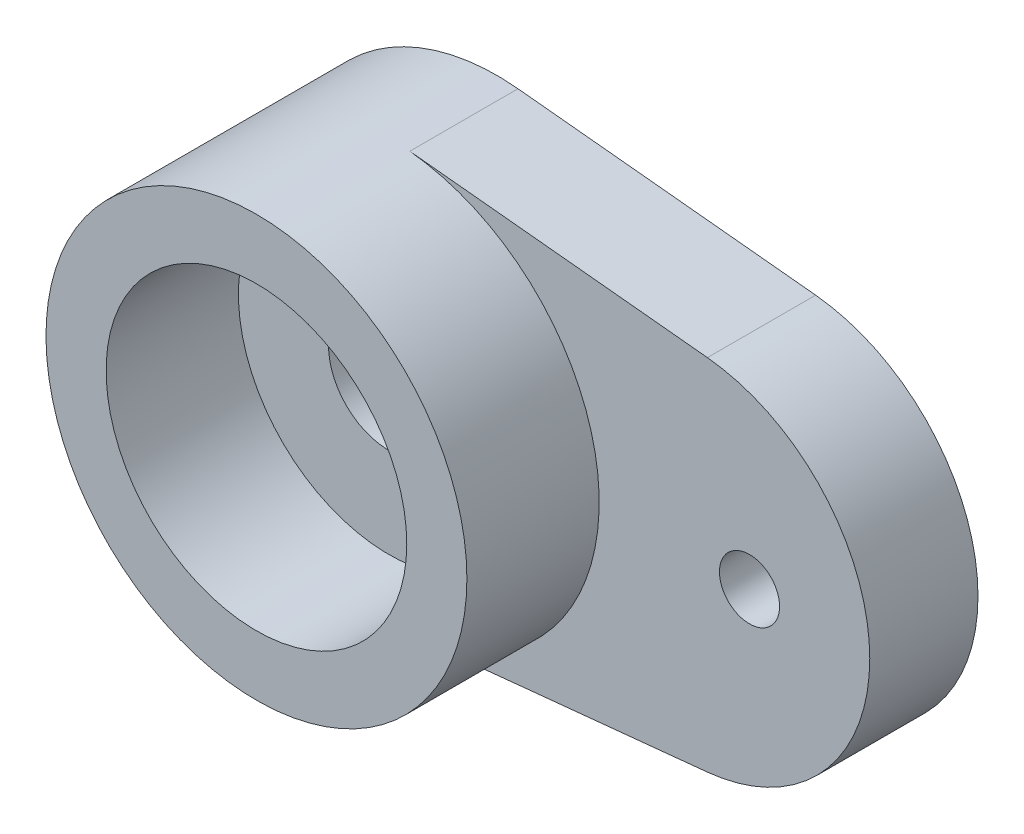
ISO-10303-21;
HEADER;
FILE_DESCRIPTION(('STEP AP214'),'2;1');
FILE_NAME('part.step','',(''),(''),'','','');
FILE_SCHEMA(('AUTOMOTIVE_DESIGN { 1 0 10303 214 1 1 1 1 }'));
ENDSEC;
DATA;
#1=APPLICATION_CONTEXT('core data for automotive mechanical design processes');
#2=APPLICATION_PROTOCOL_DEFINITION('international standard','automotive_design',2000,#1);
#3=PRODUCT_CONTEXT('',#1,'mechanical');
#4=PRODUCT('Part','Part','',(#3));
#5=PRODUCT_RELATED_PRODUCT_CATEGORY('part','',(#4));
#6=PRODUCT_DEFINITION_FORMATION('','',#4);
#7=PRODUCT_DEFINITION_CONTEXT('part definition',#1,'design');
#8=PRODUCT_DEFINITION('design','',#6,#7);
#9=PRODUCT_DEFINITION_SHAPE('','',#8);
#10=(LENGTH_UNIT() NAMED_UNIT(*) SI_UNIT(.MILLI.,.METRE.));
#11=(NAMED_UNIT(*) PLANE_ANGLE_UNIT() SI_UNIT($,.RADIAN.));
#12=(NAMED_UNIT(*) SI_UNIT($,.STERADIAN.) SOLID_ANGLE_UNIT());
#13=UNCERTAINTY_MEASURE_WITH_UNIT(LENGTH_MEASURE(1.E-05),#10,'distance_accuracy_value','');
#14=(GEOMETRIC_REPRESENTATION_CONTEXT(3) GLOBAL_UNCERTAINTY_ASSIGNED_CONTEXT((#13)) GLOBAL_UNIT_ASSIGNED_CONTEXT((#10,
#11,#12)) REPRESENTATION_CONTEXT('',''));
#15=CARTESIAN_POINT('',(0.,0.,0.));
#16=DIRECTION('',(0.,0.,1.));
#17=DIRECTION('',(1.,0.,0.));
#18=AXIS2_PLACEMENT_3D('',#15,#16,#17);
#19=CARTESIAN_POINT('',(0.,0.,1.8));
#20=DIRECTION('',(0.,0.,1.));
#21=DIRECTION('',(1.,0.,0.));
#22=AXIS2_PLACEMENT_3D('',#19,#20,#21);
#23=PLANE('',#22);
#24=CARTESIAN_POINT('',(0.,0.,1.8));
#25=DIRECTION('',(0.,0.,1.));
#26=DIRECTION('',(1.,0.,0.));
#27=AXIS2_PLACEMENT_3D('',#24,#25,#26);
#28=CIRCLE('',#27,1.);
#29=CARTESIAN_POINT('',(1.,0.,1.8));
#30=VERTEX_POINT('',#29);
#31=EDGE_CURVE('E116',#30,#30,#28,.T.);
#32=ORIENTED_EDGE('',*,*,#31,.F.);
#33=EDGE_LOOP('',(#32));
#34=FACE_BOUND('',#33,.T.);
#35=CARTESIAN_POINT('',(0.,0.,1.8));
#36=DIRECTION('',(0.,0.,1.));
#37=DIRECTION('',(1.,0.,0.));
#38=AXIS2_PLACEMENT_3D('',#35,#36,#37);
#39=CIRCLE('',#38,2.5);
#40=CARTESIAN_POINT('',(2.5,0.,1.8));
#41=VERTEX_POINT('',#40);
#42=EDGE_CURVE('E133',#41,#41,#39,.T.);
#43=ORIENTED_EDGE('',*,*,#42,.T.);
#44=EDGE_LOOP('',(#43));
#45=FACE_BOUND('',#44,.T.);
#46=ADVANCED_FACE('F33',(#34,#45),#23,.T.);
#47=CARTESIAN_POINT('',(0.,0.,1.8));
#48=DIRECTION('',(0.,0.,1.));
#49=DIRECTION('',(1.,0.,0.));
#50=AXIS2_PLACEMENT_3D('',#47,#48,#49);
#51=CIRCLE('',#50,3.5);
#52=CARTESIAN_POINT('',(0.35,-3.48245602987317,1.8));
#53=VERTEX_POINT('',#52);
#54=CARTESIAN_POINT('',(0.35,3.48245602987317,1.8));
#55=VERTEX_POINT('',#54);
#56=EDGE_CURVE('E11',#53,#55,#51,.T.);
#57=ORIENTED_EDGE('',*,*,#56,.F.);
#58=DIRECTION('',(0.99498743710662,0.1,0.));
#59=VECTOR('',#58,1.);
#60=CARTESIAN_POINT('',(5.3,-2.98496231131986,1.8));
#61=LINE('',#60,#59);
#62=CARTESIAN_POINT('',(5.3,-2.98496231131986,1.8));
#63=VERTEX_POINT('',#62);
#64=EDGE_CURVE('E102',#53,#63,#61,.T.);
#65=ORIENTED_EDGE('',*,*,#64,.T.);
#66=CARTESIAN_POINT('',(5.,0.,1.8));
#67=DIRECTION('',(0.,0.,1.));
#68=DIRECTION('',(-1.,0.,0.));
#69=AXIS2_PLACEMENT_3D('',#66,#67,#68);
#70=CIRCLE('',#69,3.);
#71=CARTESIAN_POINT('',(5.3,2.98496231131986,1.8));
#72=VERTEX_POINT('',#71);
#73=EDGE_CURVE('E52',#63,#72,#70,.T.);
#74=ORIENTED_EDGE('',*,*,#73,.T.);
#75=DIRECTION('',(-0.99498743710662,0.1,0.));
#76=VECTOR('',#75,1.);
#77=CARTESIAN_POINT('',(0.35,3.48245602987317,1.8));
#78=LINE('',#77,#76);
#79=EDGE_CURVE('E83',#72,#55,#78,.T.);
#80=ORIENTED_EDGE('',*,*,#79,.T.);
#81=EDGE_LOOP('',(#57,#65,#74,#80));
#82=FACE_BOUND('',#81,.T.);
#83=CARTESIAN_POINT('',(6.,0.,1.8));
#84=DIRECTION('',(0.,0.,1.));
#85=DIRECTION('',(1.,0.,0.));
#86=AXIS2_PLACEMENT_3D('',#83,#84,#85);
#87=CIRCLE('',#86,0.5);
#88=CARTESIAN_POINT('',(6.5,0.,1.8));
#89=VERTEX_POINT('',#88);
#90=EDGE_CURVE('E121',#89,#89,#87,.T.);
#91=ORIENTED_EDGE('',*,*,#90,.F.);
#92=EDGE_LOOP('',(#91));
#93=FACE_BOUND('',#92,.T.);
#94=ADVANCED_FACE('F89',(#82,#93),#23,.T.);
#95=CARTESIAN_POINT('',(0.,0.,0.));
#96=DIRECTION('',(0.,0.,1.));
#97=DIRECTION('',(1.,0.,0.));
#98=AXIS2_PLACEMENT_3D('',#95,#96,#97);
#99=PLANE('',#98);
#100=CARTESIAN_POINT('',(0.,0.,0.));
#101=DIRECTION('',(0.,0.,1.));
#102=DIRECTION('',(1.,0.,0.));
#103=AXIS2_PLACEMENT_3D('',#100,#101,#102);
#104=CIRCLE('',#103,1.);
#105=CARTESIAN_POINT('',(1.,0.,0.));
#106=VERTEX_POINT('',#105);
#107=EDGE_CURVE('E118',#106,#106,#104,.T.);
#108=ORIENTED_EDGE('',*,*,#107,.T.);
#109=EDGE_LOOP('',(#108));
#110=FACE_BOUND('',#109,.T.);
#111=CARTESIAN_POINT('',(0.,0.,0.));
#112=DIRECTION('',(0.,0.,1.));
#113=DIRECTION('',(1.,0.,0.));
#114=AXIS2_PLACEMENT_3D('',#111,#112,#113);
#115=CIRCLE('',#114,3.5);
#116=CARTESIAN_POINT('',(0.35,3.48245602987317,0.));
#117=VERTEX_POINT('',#116);
#118=CARTESIAN_POINT('',(0.35,-3.48245602987317,0.));
#119=VERTEX_POINT('',#118);
#120=EDGE_CURVE('E95',#117,#119,#115,.T.);
#121=ORIENTED_EDGE('',*,*,#120,.F.);
#122=DIRECTION('',(-0.99498743710662,0.1,0.));
#123=VECTOR('',#122,1.);
#124=CARTESIAN_POINT('',(0.35,3.48245602987317,0.));
#125=LINE('',#124,#123);
#126=CARTESIAN_POINT('',(5.3,2.98496231131986,0.));
#127=VERTEX_POINT('',#126);
#128=EDGE_CURVE('E75',#127,#117,#125,.T.);
#129=ORIENTED_EDGE('',*,*,#128,.F.);
#130=CARTESIAN_POINT('',(5.,0.,0.));
#131=DIRECTION('',(0.,0.,1.));
#132=DIRECTION('',(-1.,0.,0.));
#133=AXIS2_PLACEMENT_3D('',#130,#131,#132);
#134=CIRCLE('',#133,3.);
#135=CARTESIAN_POINT('',(5.3,-2.98496231131986,0.));
#136=VERTEX_POINT('',#135);
#137=EDGE_CURVE('E69',#136,#127,#134,.T.);
#138=ORIENTED_EDGE('',*,*,#137,.F.);
#139=DIRECTION('',(0.99498743710662,0.1,0.));
#140=VECTOR('',#139,1.);
#141=CARTESIAN_POINT('',(5.3,-2.98496231131986,0.));
#142=LINE('',#141,#140);
#143=EDGE_CURVE('E113',#119,#136,#142,.T.);
#144=ORIENTED_EDGE('',*,*,#143,.F.);
#145=EDGE_LOOP('',(#121,#129,#138,#144));
#146=FACE_BOUND('',#145,.T.);
#147=CARTESIAN_POINT('',(6.,0.,0.));
#148=DIRECTION('',(0.,0.,1.));
#149=DIRECTION('',(1.,0.,0.));
#150=AXIS2_PLACEMENT_3D('',#147,#148,#149);
#151=CIRCLE('',#150,0.5);
#152=CARTESIAN_POINT('',(6.5,0.,0.));
#153=VERTEX_POINT('',#152);
#154=EDGE_CURVE('E124',#153,#153,#151,.T.);
#155=ORIENTED_EDGE('',*,*,#154,.T.);
#156=EDGE_LOOP('',(#155));
#157=FACE_BOUND('',#156,.T.);
#158=ADVANCED_FACE('F161',(#110,#146,#157),#99,.F.);
#159=CARTESIAN_POINT('',(0.,0.,1.8));
#160=DIRECTION('',(0.,0.,-1.));
#161=DIRECTION('',(-1.,0.,0.));
#162=AXIS2_PLACEMENT_3D('',#159,#160,#161);
#163=CYLINDRICAL_SURFACE('',#162,3.5);
#164=ORIENTED_EDGE('',*,*,#120,.T.);
#165=DIRECTION('',(0.,0.,-1.));
#166=VECTOR('',#165,1.);
#167=CARTESIAN_POINT('',(0.35,-3.48245602987317,1.8));
#168=LINE('',#167,#166);
#169=EDGE_CURVE('E43',#53,#119,#168,.T.);
#170=ORIENTED_EDGE('',*,*,#169,.F.);
#171=ORIENTED_EDGE('',*,*,#56,.T.);
#172=DIRECTION('',(0.,0.,-1.));
#173=VECTOR('',#172,1.);
#174=CARTESIAN_POINT('',(0.35,3.48245602987317,1.8));
#175=LINE('',#174,#173);
#176=EDGE_CURVE('E81',#55,#117,#175,.T.);
#177=ORIENTED_EDGE('',*,*,#176,.T.);
#178=EDGE_LOOP('',(#164,#170,#171,#177));
#179=FACE_BOUND('',#178,.T.);
#180=CARTESIAN_POINT('',(0.,0.,4.));
#181=DIRECTION('',(0.,0.,1.));
#182=DIRECTION('',(1.,0.,0.));
#183=AXIS2_PLACEMENT_3D('',#180,#181,#182);
#184=CIRCLE('',#183,3.5);
#185=CARTESIAN_POINT('',(3.5,0.,4.));
#186=VERTEX_POINT('',#185);
#187=EDGE_CURVE('E127',#186,#186,#184,.T.);
#188=ORIENTED_EDGE('',*,*,#187,.F.);
#189=EDGE_LOOP('',(#188));
#190=FACE_BOUND('',#189,.T.);
#191=ADVANCED_FACE('F35',(#179,#190),#163,.T.);
#192=CARTESIAN_POINT('',(5.3,-2.98496231131986,1.8));
#193=DIRECTION('',(-0.1,0.99498743710662,0.));
#194=DIRECTION('',(-0.99498743710662,-0.1,0.));
#195=AXIS2_PLACEMENT_3D('',#192,#193,#194);
#196=PLANE('',#195);
#197=ORIENTED_EDGE('',*,*,#143,.T.);
#198=DIRECTION('',(0.,0.,-1.));
#199=VECTOR('',#198,1.);
#200=CARTESIAN_POINT('',(5.3,-2.98496231131986,1.8));
#201=LINE('',#200,#199);
#202=EDGE_CURVE('E97',#63,#136,#201,.T.);
#203=ORIENTED_EDGE('',*,*,#202,.F.);
#204=ORIENTED_EDGE('',*,*,#64,.F.);
#205=ORIENTED_EDGE('',*,*,#169,.T.);
#206=EDGE_LOOP('',(#197,#203,#204,#205));
#207=FACE_BOUND('',#206,.T.);
#208=ADVANCED_FACE('F173',(#207),#196,.F.);
#209=CARTESIAN_POINT('',(5.,0.,1.8));
#210=DIRECTION('',(0.,0.,-1.));
#211=DIRECTION('',(-1.,0.,0.));
#212=AXIS2_PLACEMENT_3D('',#209,#210,#211);
#213=CYLINDRICAL_SURFACE('',#212,3.);
#214=ORIENTED_EDGE('',*,*,#137,.T.);
#215=DIRECTION('',(0.,0.,-1.));
#216=VECTOR('',#215,1.);
#217=CARTESIAN_POINT('',(5.3,2.98496231131986,1.8));
#218=LINE('',#217,#216);
#219=EDGE_CURVE('E87',#72,#127,#218,.T.);
#220=ORIENTED_EDGE('',*,*,#219,.F.);
#221=ORIENTED_EDGE('',*,*,#73,.F.);
#222=ORIENTED_EDGE('',*,*,#202,.T.);
#223=EDGE_LOOP('',(#214,#220,#221,#222));
#224=FACE_BOUND('',#223,.T.);
#225=ADVANCED_FACE('F171',(#224),#213,.T.);
#226=CARTESIAN_POINT('',(0.35,3.48245602987317,1.8));
#227=DIRECTION('',(-0.1,-0.99498743710662,0.));
#228=DIRECTION('',(0.99498743710662,-0.1,0.));
#229=AXIS2_PLACEMENT_3D('',#226,#227,#228);
#230=PLANE('',#229);
#231=ORIENTED_EDGE('',*,*,#128,.T.);
#232=ORIENTED_EDGE('',*,*,#176,.F.);
#233=ORIENTED_EDGE('',*,*,#79,.F.);
#234=ORIENTED_EDGE('',*,*,#219,.T.);
#235=EDGE_LOOP('',(#231,#232,#233,#234));
#236=FACE_BOUND('',#235,.T.);
#237=ADVANCED_FACE('F82',(#236),#230,.F.);
#238=CARTESIAN_POINT('',(0.,0.,1.8));
#239=DIRECTION('',(0.,0.,-1.));
#240=DIRECTION('',(-1.,0.,0.));
#241=AXIS2_PLACEMENT_3D('',#238,#239,#240);
#242=CYLINDRICAL_SURFACE('',#241,1.);
#243=ORIENTED_EDGE('',*,*,#31,.T.);
#244=EDGE_LOOP('',(#243));
#245=FACE_BOUND('',#244,.T.);
#246=ORIENTED_EDGE('',*,*,#107,.F.);
#247=EDGE_LOOP('',(#246));
#248=FACE_BOUND('',#247,.T.);
#249=ADVANCED_FACE('F152',(#245,#248),#242,.F.);
#250=CARTESIAN_POINT('',(6.,0.,1.8));
#251=DIRECTION('',(0.,0.,-1.));
#252=DIRECTION('',(-1.,0.,0.));
#253=AXIS2_PLACEMENT_3D('',#250,#251,#252);
#254=CYLINDRICAL_SURFACE('',#253,0.5);
#255=ORIENTED_EDGE('',*,*,#90,.T.);
#256=EDGE_LOOP('',(#255));
#257=FACE_BOUND('',#256,.T.);
#258=ORIENTED_EDGE('',*,*,#154,.F.);
#259=EDGE_LOOP('',(#258));
#260=FACE_BOUND('',#259,.T.);
#261=ADVANCED_FACE('F144',(#257,#260),#254,.F.);
#262=CARTESIAN_POINT('',(0.,0.,4.));
#263=DIRECTION('',(0.,0.,1.));
#264=DIRECTION('',(1.,0.,0.));
#265=AXIS2_PLACEMENT_3D('',#262,#263,#264);
#266=PLANE('',#265);
#267=ORIENTED_EDGE('',*,*,#187,.T.);
#268=EDGE_LOOP('',(#267));
#269=FACE_BOUND('',#268,.T.);
#270=CARTESIAN_POINT('',(0.,0.,4.));
#271=DIRECTION('',(0.,0.,1.));
#272=DIRECTION('',(1.,0.,0.));
#273=AXIS2_PLACEMENT_3D('',#270,#271,#272);
#274=CIRCLE('',#273,2.5);
#275=CARTESIAN_POINT('',(2.5,0.,4.));
#276=VERTEX_POINT('',#275);
#277=EDGE_CURVE('E132',#276,#276,#274,.T.);
#278=ORIENTED_EDGE('',*,*,#277,.F.);
#279=EDGE_LOOP('',(#278));
#280=FACE_BOUND('',#279,.T.);
#281=ADVANCED_FACE('F142',(#269,#280),#266,.T.);
#282=CARTESIAN_POINT('',(0.,0.,4.));
#283=DIRECTION('',(0.,0.,-1.));
#284=DIRECTION('',(-1.,0.,0.));
#285=AXIS2_PLACEMENT_3D('',#282,#283,#284);
#286=CYLINDRICAL_SURFACE('',#285,2.5);
#287=ORIENTED_EDGE('',*,*,#277,.T.);
#288=EDGE_LOOP('',(#287));
#289=FACE_BOUND('',#288,.T.);
#290=ORIENTED_EDGE('',*,*,#42,.F.);
#291=EDGE_LOOP('',(#290));
#292=FACE_BOUND('',#291,.T.);
#293=ADVANCED_FACE('F139',(#289,#292),#286,.F.);
#294=CLOSED_SHELL('',(#46,#94,#158,#191,#208,#225,#237,#249,#261,#281,#293));
#295=MANIFOLD_SOLID_BREP('B2',#294);
#296=ADVANCED_BREP_SHAPE_REPRESENTATION('',(#18,#295),#14);
#297=SHAPE_DEFINITION_REPRESENTATION(#9,#296);
ENDSEC;
END-ISO-10303-21;
